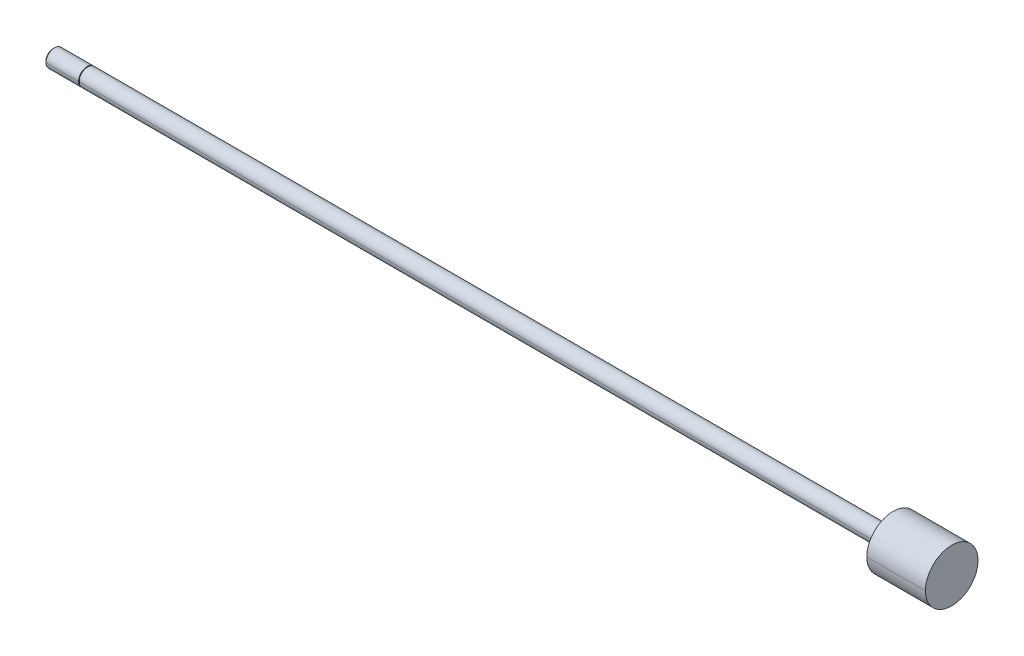
ISO-10303-21;
HEADER;
FILE_DESCRIPTION(('STEP AP214'),'2;1');
FILE_NAME('part.step','',(''),(''),'','','');
FILE_SCHEMA(('AUTOMOTIVE_DESIGN { 1 0 10303 214 1 1 1 1 }'));
ENDSEC;
DATA;
#1=APPLICATION_CONTEXT('core data for automotive mechanical design processes');
#2=APPLICATION_PROTOCOL_DEFINITION('international standard','automotive_design',2000,#1);
#3=PRODUCT_CONTEXT('',#1,'mechanical');
#4=PRODUCT('Part','Part','',(#3));
#5=PRODUCT_RELATED_PRODUCT_CATEGORY('part','',(#4));
#6=PRODUCT_DEFINITION_FORMATION('','',#4);
#7=PRODUCT_DEFINITION_CONTEXT('part definition',#1,'design');
#8=PRODUCT_DEFINITION('design','',#6,#7);
#9=PRODUCT_DEFINITION_SHAPE('','',#8);
#10=(LENGTH_UNIT() NAMED_UNIT(*) SI_UNIT(.MILLI.,.METRE.));
#11=(NAMED_UNIT(*) PLANE_ANGLE_UNIT() SI_UNIT($,.RADIAN.));
#12=(NAMED_UNIT(*) SI_UNIT($,.STERADIAN.) SOLID_ANGLE_UNIT());
#13=UNCERTAINTY_MEASURE_WITH_UNIT(LENGTH_MEASURE(1.E-05),#10,'distance_accuracy_value','');
#14=(GEOMETRIC_REPRESENTATION_CONTEXT(3) GLOBAL_UNCERTAINTY_ASSIGNED_CONTEXT((#13)) GLOBAL_UNIT_ASSIGNED_CONTEXT((#10,
#11,#12)) REPRESENTATION_CONTEXT('',''));
#15=CARTESIAN_POINT('',(0.,0.,0.));
#16=DIRECTION('',(0.,0.,1.));
#17=DIRECTION('',(1.,0.,0.));
#18=AXIS2_PLACEMENT_3D('',#15,#16,#17);
#19=CARTESIAN_POINT('',(0.,0.,0.));
#20=DIRECTION('',(-1.,0.,0.));
#21=DIRECTION('',(0.,-1.,0.));
#22=AXIS2_PLACEMENT_3D('',#19,#20,#21);
#23=CYLINDRICAL_SURFACE('',#22,2.921);
#24=CARTESIAN_POINT('',(0.,0.,0.));
#25=DIRECTION('',(1.,0.,0.));
#26=DIRECTION('',(0.,0.,-1.));
#27=AXIS2_PLACEMENT_3D('',#24,#25,#26);
#28=CIRCLE('',#27,2.921);
#29=CARTESIAN_POINT('',(0.,0.,-2.921));
#30=VERTEX_POINT('',#29);
#31=CARTESIAN_POINT('',(0.,0.,2.921));
#32=VERTEX_POINT('',#31);
#33=EDGE_CURVE('E10',#30,#32,#28,.T.);
#34=ORIENTED_EDGE('',*,*,#33,.F.);
#35=DIRECTION('',(-1.,0.,0.));
#36=VECTOR('',#35,1.);
#37=CARTESIAN_POINT('',(0.,0.,-2.921));
#38=LINE('',#37,#36);
#39=CARTESIAN_POINT('',(-0.254,0.,-2.921));
#40=VERTEX_POINT('',#39);
#41=EDGE_CURVE('E23',#30,#40,#38,.T.);
#42=ORIENTED_EDGE('',*,*,#41,.T.);
#43=CARTESIAN_POINT('',(-0.254,0.,0.));
#44=DIRECTION('',(1.,0.,0.));
#45=DIRECTION('',(0.,0.,-1.));
#46=AXIS2_PLACEMENT_3D('',#43,#44,#45);
#47=CIRCLE('',#46,2.921);
#48=CARTESIAN_POINT('',(-0.254,0.,2.921));
#49=VERTEX_POINT('',#48);
#50=EDGE_CURVE('E209',#40,#49,#47,.T.);
#51=ORIENTED_EDGE('',*,*,#50,.T.);
#52=DIRECTION('',(-1.,0.,0.));
#53=VECTOR('',#52,1.);
#54=CARTESIAN_POINT('',(0.,0.,2.921));
#55=LINE('',#54,#53);
#56=EDGE_CURVE('E204',#32,#49,#55,.T.);
#57=ORIENTED_EDGE('',*,*,#56,.F.);
#58=EDGE_LOOP('',(#34,#42,#51,#57));
#59=FACE_BOUND('',#58,.T.);
#60=ADVANCED_FACE('F15',(#59),#23,.T.);
#61=CARTESIAN_POINT('',(0.,0.,0.));
#62=DIRECTION('',(-1.,0.,0.));
#63=DIRECTION('',(0.,1.,0.));
#64=AXIS2_PLACEMENT_3D('',#61,#62,#63);
#65=CYLINDRICAL_SURFACE('',#64,2.921);
#66=CARTESIAN_POINT('',(-0.254,0.,0.));
#67=DIRECTION('',(1.,0.,0.));
#68=DIRECTION('',(0.,0.,-1.));
#69=AXIS2_PLACEMENT_3D('',#66,#67,#68);
#70=CIRCLE('',#69,2.921);
#71=EDGE_CURVE('E200',#49,#40,#70,.T.);
#72=ORIENTED_EDGE('',*,*,#71,.T.);
#73=ORIENTED_EDGE('',*,*,#41,.F.);
#74=CARTESIAN_POINT('',(0.,0.,0.));
#75=DIRECTION('',(1.,0.,0.));
#76=DIRECTION('',(0.,0.,-1.));
#77=AXIS2_PLACEMENT_3D('',#74,#75,#76);
#78=CIRCLE('',#77,2.921);
#79=EDGE_CURVE('E195',#32,#30,#78,.T.);
#80=ORIENTED_EDGE('',*,*,#79,.F.);
#81=ORIENTED_EDGE('',*,*,#56,.T.);
#82=EDGE_LOOP('',(#72,#73,#80,#81));
#83=FACE_BOUND('',#82,.T.);
#84=ADVANCED_FACE('F222',(#83),#65,.T.);
#85=CARTESIAN_POINT('',(0.,2.921,0.));
#86=DIRECTION('',(1.,0.,0.));
#87=DIRECTION('',(0.,0.,-1.));
#88=AXIS2_PLACEMENT_3D('',#85,#86,#87);
#89=PLANE('',#88);
#90=CARTESIAN_POINT('',(0.,0.,0.));
#91=DIRECTION('',(1.,0.,0.));
#92=DIRECTION('',(0.,0.,-1.));
#93=AXIS2_PLACEMENT_3D('',#90,#91,#92);
#94=CIRCLE('',#93,3.175);
#95=CARTESIAN_POINT('',(0.,0.,-3.175));
#96=VERTEX_POINT('',#95);
#97=CARTESIAN_POINT('',(0.,0.,3.175));
#98=VERTEX_POINT('',#97);
#99=EDGE_CURVE('E190',#96,#98,#94,.T.);
#100=ORIENTED_EDGE('',*,*,#99,.F.);
#101=CARTESIAN_POINT('',(0.,0.,0.));
#102=DIRECTION('',(1.,0.,0.));
#103=DIRECTION('',(0.,0.,-1.));
#104=AXIS2_PLACEMENT_3D('',#101,#102,#103);
#105=CIRCLE('',#104,3.175);
#106=EDGE_CURVE('E185',#98,#96,#105,.T.);
#107=ORIENTED_EDGE('',*,*,#106,.F.);
#108=EDGE_LOOP('',(#100,#107));
#109=FACE_BOUND('',#108,.T.);
#110=ORIENTED_EDGE('',*,*,#33,.T.);
#111=ORIENTED_EDGE('',*,*,#79,.T.);
#112=EDGE_LOOP('',(#110,#111));
#113=FACE_BOUND('',#112,.T.);
#114=ADVANCED_FACE('F247',(#109,#113),#89,.F.);
#115=CARTESIAN_POINT('',(315.9252,0.,0.));
#116=DIRECTION('',(-1.,0.,0.));
#117=DIRECTION('',(0.,1.,0.));
#118=AXIS2_PLACEMENT_3D('',#115,#116,#117);
#119=CYLINDRICAL_SURFACE('',#118,3.175);
#120=ORIENTED_EDGE('',*,*,#106,.T.);
#121=DIRECTION('',(-1.,0.,0.));
#122=VECTOR('',#121,1.);
#123=CARTESIAN_POINT('',(294.4876,0.,-3.175));
#124=LINE('',#123,#122);
#125=CARTESIAN_POINT('',(294.4876,0.,-3.175));
#126=VERTEX_POINT('',#125);
#127=EDGE_CURVE('E180',#126,#96,#124,.T.);
#128=ORIENTED_EDGE('',*,*,#127,.F.);
#129=CARTESIAN_POINT('',(294.4876,0.,0.));
#130=DIRECTION('',(1.,0.,0.));
#131=DIRECTION('',(0.,0.,-1.));
#132=AXIS2_PLACEMENT_3D('',#129,#130,#131);
#133=CIRCLE('',#132,3.175);
#134=CARTESIAN_POINT('',(294.4876,0.,3.175));
#135=VERTEX_POINT('',#134);
#136=EDGE_CURVE('E175',#135,#126,#133,.T.);
#137=ORIENTED_EDGE('',*,*,#136,.F.);
#138=DIRECTION('',(-1.,0.,0.));
#139=VECTOR('',#138,1.);
#140=CARTESIAN_POINT('',(294.4876,0.,3.175));
#141=LINE('',#140,#139);
#142=EDGE_CURVE('E170',#135,#98,#141,.T.);
#143=ORIENTED_EDGE('',*,*,#142,.T.);
#144=EDGE_LOOP('',(#120,#128,#137,#143));
#145=FACE_BOUND('',#144,.T.);
#146=ADVANCED_FACE('F251',(#145),#119,.T.);
#147=CARTESIAN_POINT('',(315.9252,0.,0.));
#148=DIRECTION('',(-1.,0.,0.));
#149=DIRECTION('',(0.,-1.,0.));
#150=AXIS2_PLACEMENT_3D('',#147,#148,#149);
#151=CYLINDRICAL_SURFACE('',#150,3.175);
#152=CARTESIAN_POINT('',(294.4876,0.,0.));
#153=DIRECTION('',(1.,0.,0.));
#154=DIRECTION('',(0.,0.,-1.));
#155=AXIS2_PLACEMENT_3D('',#152,#153,#154);
#156=CIRCLE('',#155,3.175);
#157=EDGE_CURVE('E165',#126,#135,#156,.T.);
#158=ORIENTED_EDGE('',*,*,#157,.F.);
#159=ORIENTED_EDGE('',*,*,#127,.T.);
#160=ORIENTED_EDGE('',*,*,#99,.T.);
#161=ORIENTED_EDGE('',*,*,#142,.F.);
#162=EDGE_LOOP('',(#158,#159,#160,#161));
#163=FACE_BOUND('',#162,.T.);
#164=ADVANCED_FACE('F257',(#163),#151,.T.);
#165=CARTESIAN_POINT('',(294.4876,3.175,0.));
#166=DIRECTION('',(1.,0.,0.));
#167=DIRECTION('',(0.,0.,-1.));
#168=AXIS2_PLACEMENT_3D('',#165,#166,#167);
#169=PLANE('',#168);
#170=CARTESIAN_POINT('',(294.4876,0.,0.));
#171=DIRECTION('',(1.,0.,0.));
#172=DIRECTION('',(0.,0.,-1.));
#173=AXIS2_PLACEMENT_3D('',#170,#171,#172);
#174=CIRCLE('',#173,9.62025);
#175=CARTESIAN_POINT('',(294.4876,0.,-9.62025));
#176=VERTEX_POINT('',#175);
#177=CARTESIAN_POINT('',(294.4876,0.,9.62025));
#178=VERTEX_POINT('',#177);
#179=EDGE_CURVE('E160',#176,#178,#174,.T.);
#180=ORIENTED_EDGE('',*,*,#179,.F.);
#181=CARTESIAN_POINT('',(294.4876,0.,0.));
#182=DIRECTION('',(1.,0.,0.));
#183=DIRECTION('',(0.,0.,-1.));
#184=AXIS2_PLACEMENT_3D('',#181,#182,#183);
#185=CIRCLE('',#184,9.62025);
#186=EDGE_CURVE('E155',#178,#176,#185,.T.);
#187=ORIENTED_EDGE('',*,*,#186,.F.);
#188=EDGE_LOOP('',(#180,#187));
#189=FACE_BOUND('',#188,.T.);
#190=ORIENTED_EDGE('',*,*,#157,.T.);
#191=ORIENTED_EDGE('',*,*,#136,.T.);
#192=EDGE_LOOP('',(#190,#191));
#193=FACE_BOUND('',#192,.T.);
#194=ADVANCED_FACE('F261',(#189,#193),#169,.F.);
#195=CARTESIAN_POINT('',(315.9252,0.,0.));
#196=DIRECTION('',(-1.,0.,0.));
#197=DIRECTION('',(0.,1.,0.));
#198=AXIS2_PLACEMENT_3D('',#195,#196,#197);
#199=CYLINDRICAL_SURFACE('',#198,9.62025);
#200=ORIENTED_EDGE('',*,*,#186,.T.);
#201=DIRECTION('',(-1.,0.,0.));
#202=VECTOR('',#201,1.);
#203=CARTESIAN_POINT('',(315.9252,0.,-9.62025));
#204=LINE('',#203,#202);
#205=CARTESIAN_POINT('',(315.9252,0.,-9.62025));
#206=VERTEX_POINT('',#205);
#207=EDGE_CURVE('E150',#206,#176,#204,.T.);
#208=ORIENTED_EDGE('',*,*,#207,.F.);
#209=CARTESIAN_POINT('',(315.9252,0.,0.));
#210=DIRECTION('',(1.,0.,0.));
#211=DIRECTION('',(0.,0.,-1.));
#212=AXIS2_PLACEMENT_3D('',#209,#210,#211);
#213=CIRCLE('',#212,9.62025);
#214=CARTESIAN_POINT('',(315.9252,0.,9.62025));
#215=VERTEX_POINT('',#214);
#216=EDGE_CURVE('E145',#215,#206,#213,.T.);
#217=ORIENTED_EDGE('',*,*,#216,.F.);
#218=DIRECTION('',(-1.,0.,0.));
#219=VECTOR('',#218,1.);
#220=CARTESIAN_POINT('',(315.9252,0.,9.62025));
#221=LINE('',#220,#219);
#222=EDGE_CURVE('E140',#215,#178,#221,.T.);
#223=ORIENTED_EDGE('',*,*,#222,.T.);
#224=EDGE_LOOP('',(#200,#208,#217,#223));
#225=FACE_BOUND('',#224,.T.);
#226=ADVANCED_FACE('F265',(#225),#199,.T.);
#227=CARTESIAN_POINT('',(315.9252,0.,0.));
#228=DIRECTION('',(-1.,0.,0.));
#229=DIRECTION('',(0.,-1.,0.));
#230=AXIS2_PLACEMENT_3D('',#227,#228,#229);
#231=CYLINDRICAL_SURFACE('',#230,9.62025);
#232=CARTESIAN_POINT('',(315.9252,0.,0.));
#233=DIRECTION('',(1.,0.,0.));
#234=DIRECTION('',(0.,0.,-1.));
#235=AXIS2_PLACEMENT_3D('',#232,#233,#234);
#236=CIRCLE('',#235,9.62025);
#237=EDGE_CURVE('E135',#206,#215,#236,.T.);
#238=ORIENTED_EDGE('',*,*,#237,.F.);
#239=ORIENTED_EDGE('',*,*,#207,.T.);
#240=ORIENTED_EDGE('',*,*,#179,.T.);
#241=ORIENTED_EDGE('',*,*,#222,.F.);
#242=EDGE_LOOP('',(#238,#239,#240,#241));
#243=FACE_BOUND('',#242,.T.);
#244=ADVANCED_FACE('F269',(#243),#231,.T.);
#245=CARTESIAN_POINT('',(315.9252,9.62025,0.));
#246=DIRECTION('',(-1.,0.,0.));
#247=DIRECTION('',(0.,0.,1.));
#248=AXIS2_PLACEMENT_3D('',#245,#246,#247);
#249=PLANE('',#248);
#250=ORIENTED_EDGE('',*,*,#237,.T.);
#251=ORIENTED_EDGE('',*,*,#216,.T.);
#252=EDGE_LOOP('',(#250,#251));
#253=FACE_BOUND('',#252,.T.);
#254=ADVANCED_FACE('F227',(#253),#249,.F.);
#255=CARTESIAN_POINT('',(-0.254,3.429,0.));
#256=DIRECTION('',(-1.,0.,0.));
#257=DIRECTION('',(0.,0.,1.));
#258=AXIS2_PLACEMENT_3D('',#255,#256,#257);
#259=PLANE('',#258);
#260=ORIENTED_EDGE('',*,*,#50,.F.);
#261=ORIENTED_EDGE('',*,*,#71,.F.);
#262=EDGE_LOOP('',(#260,#261));
#263=FACE_BOUND('',#262,.T.);
#264=CARTESIAN_POINT('',(-0.253999999999976,0.,0.));
#265=DIRECTION('',(-1.,0.,0.));
#266=DIRECTION('',(0.,0.,1.));
#267=AXIS2_PLACEMENT_3D('',#264,#265,#266);
#268=CIRCLE('',#267,3.175);
#269=CARTESIAN_POINT('',(-0.253999999999976,0.,3.175));
#270=VERTEX_POINT('',#269);
#271=CARTESIAN_POINT('',(-0.253999999999962,0.,-3.175));
#272=VERTEX_POINT('',#271);
#273=EDGE_CURVE('E130',#270,#272,#268,.T.);
#274=ORIENTED_EDGE('',*,*,#273,.F.);
#275=CARTESIAN_POINT('',(-0.253999999999976,0.,0.));
#276=DIRECTION('',(-1.,0.,0.));
#277=DIRECTION('',(0.,0.,1.));
#278=AXIS2_PLACEMENT_3D('',#275,#276,#277);
#279=CIRCLE('',#278,3.175);
#280=EDGE_CURVE('E125',#272,#270,#279,.T.);
#281=ORIENTED_EDGE('',*,*,#280,.F.);
#282=EDGE_LOOP('',(#274,#281));
#283=FACE_BOUND('',#282,.T.);
#284=ADVANCED_FACE('F223',(#263,#283),#259,.F.);
#285=CARTESIAN_POINT('',(315.9252,0.,0.));
#286=DIRECTION('',(-1.,0.,0.));
#287=DIRECTION('',(0.,1.,0.));
#288=AXIS2_PLACEMENT_3D('',#285,#286,#287);
#289=CYLINDRICAL_SURFACE('',#288,3.175);
#290=CARTESIAN_POINT('',(-12.15898,0.,0.));
#291=DIRECTION('',(1.,0.,0.));
#292=DIRECTION('',(0.,0.,-1.));
#293=AXIS2_PLACEMENT_3D('',#290,#291,#292);
#294=CIRCLE('',#293,3.175);
#295=CARTESIAN_POINT('',(-12.15898,0.,3.175));
#296=VERTEX_POINT('',#295);
#297=CARTESIAN_POINT('',(-12.15898,0.,-3.175));
#298=VERTEX_POINT('',#297);
#299=EDGE_CURVE('E96',#296,#298,#294,.T.);
#300=ORIENTED_EDGE('',*,*,#299,.T.);
#301=DIRECTION('',(-1.,0.,0.));
#302=VECTOR('',#301,1.);
#303=CARTESIAN_POINT('',(-0.253999999999962,0.,-3.175));
#304=LINE('',#303,#302);
#305=EDGE_CURVE('E117',#272,#298,#304,.T.);
#306=ORIENTED_EDGE('',*,*,#305,.F.);
#307=ORIENTED_EDGE('',*,*,#280,.T.);
#308=DIRECTION('',(-1.,0.,0.));
#309=VECTOR('',#308,1.);
#310=CARTESIAN_POINT('',(-0.253999999999962,0.,3.175));
#311=LINE('',#310,#309);
#312=EDGE_CURVE('E113',#270,#296,#311,.T.);
#313=ORIENTED_EDGE('',*,*,#312,.T.);
#314=EDGE_LOOP('',(#300,#306,#307,#313));
#315=FACE_BOUND('',#314,.T.);
#316=ADVANCED_FACE('F226',(#315),#289,.T.);
#317=CARTESIAN_POINT('',(315.9252,0.,0.));
#318=DIRECTION('',(-1.,0.,0.));
#319=DIRECTION('',(0.,-1.,0.));
#320=AXIS2_PLACEMENT_3D('',#317,#318,#319);
#321=CYLINDRICAL_SURFACE('',#320,3.175);
#322=ORIENTED_EDGE('',*,*,#273,.T.);
#323=ORIENTED_EDGE('',*,*,#305,.T.);
#324=CARTESIAN_POINT('',(-12.15898,0.,0.));
#325=DIRECTION('',(1.,0.,0.));
#326=DIRECTION('',(0.,0.,-1.));
#327=AXIS2_PLACEMENT_3D('',#324,#325,#326);
#328=CIRCLE('',#327,3.175);
#329=EDGE_CURVE('E108',#298,#296,#328,.T.);
#330=ORIENTED_EDGE('',*,*,#329,.T.);
#331=ORIENTED_EDGE('',*,*,#312,.F.);
#332=EDGE_LOOP('',(#322,#323,#330,#331));
#333=FACE_BOUND('',#332,.T.);
#334=ADVANCED_FACE('F233',(#333),#321,.T.);
#335=CARTESIAN_POINT('',(-12.7,0.,0.));
#336=DIRECTION('',(1.,0.,0.));
#337=DIRECTION('',(0.,-1.,0.));
#338=AXIS2_PLACEMENT_3D('',#335,#336,#337);
#339=CONICAL_SURFACE('',#338,2.63398,0.7853981634);
#340=ORIENTED_EDGE('',*,*,#329,.F.);
#341=DIRECTION('',(0.707106781184742,0.,-0.707106781188353));
#342=VECTOR('',#341,1.);
#343=CARTESIAN_POINT('',(-12.7,0.,-2.63398));
#344=LINE('',#343,#342);
#345=CARTESIAN_POINT('',(-12.7,0.,-2.63398));
#346=VERTEX_POINT('',#345);
#347=EDGE_CURVE('E88',#346,#298,#344,.T.);
#348=ORIENTED_EDGE('',*,*,#347,.F.);
#349=CARTESIAN_POINT('',(-12.7,0.,0.));
#350=DIRECTION('',(1.,0.,0.));
#351=DIRECTION('',(0.,0.,-1.));
#352=AXIS2_PLACEMENT_3D('',#349,#350,#351);
#353=CIRCLE('',#352,2.63398);
#354=CARTESIAN_POINT('',(-12.7,0.,2.63398));
#355=VERTEX_POINT('',#354);
#356=EDGE_CURVE('E81',#346,#355,#353,.T.);
#357=ORIENTED_EDGE('',*,*,#356,.T.);
#358=DIRECTION('',(0.707106781184742,0.,0.707106781188353));
#359=VECTOR('',#358,1.);
#360=CARTESIAN_POINT('',(-12.7,0.,2.63398));
#361=LINE('',#360,#359);
#362=EDGE_CURVE('E85',#355,#296,#361,.T.);
#363=ORIENTED_EDGE('',*,*,#362,.T.);
#364=EDGE_LOOP('',(#340,#348,#357,#363));
#365=FACE_BOUND('',#364,.T.);
#366=ADVANCED_FACE('F84',(#365),#339,.T.);
#367=CARTESIAN_POINT('',(-12.7,0.,0.));
#368=DIRECTION('',(1.,0.,0.));
#369=DIRECTION('',(0.,1.,0.));
#370=AXIS2_PLACEMENT_3D('',#367,#368,#369);
#371=CONICAL_SURFACE('',#370,2.63398,0.7853981634);
#372=CARTESIAN_POINT('',(-12.7,0.,0.));
#373=DIRECTION('',(1.,0.,0.));
#374=DIRECTION('',(0.,0.,-1.));
#375=AXIS2_PLACEMENT_3D('',#372,#373,#374);
#376=CIRCLE('',#375,2.63398);
#377=EDGE_CURVE('E95',#355,#346,#376,.T.);
#378=ORIENTED_EDGE('',*,*,#377,.T.);
#379=ORIENTED_EDGE('',*,*,#347,.T.);
#380=ORIENTED_EDGE('',*,*,#299,.F.);
#381=ORIENTED_EDGE('',*,*,#362,.F.);
#382=EDGE_LOOP('',(#378,#379,#380,#381));
#383=FACE_BOUND('',#382,.T.);
#384=ADVANCED_FACE('F94',(#383),#371,.T.);
#385=CARTESIAN_POINT('',(-12.7,0.,0.));
#386=DIRECTION('',(1.,0.,0.));
#387=DIRECTION('',(0.,0.,-1.));
#388=AXIS2_PLACEMENT_3D('',#385,#386,#387);
#389=PLANE('',#388);
#390=ORIENTED_EDGE('',*,*,#356,.F.);
#391=ORIENTED_EDGE('',*,*,#377,.F.);
#392=EDGE_LOOP('',(#390,#391));
#393=FACE_BOUND('',#392,.T.);
#394=ADVANCED_FACE('F98',(#393),#389,.F.);
#395=CLOSED_SHELL('',(#60,#84,#114,#146,#164,#194,#226,#244,#254,#284,#316,#334,#366,#384,#394));
#396=MANIFOLD_SOLID_BREP('B1',#395);
#397=ADVANCED_BREP_SHAPE_REPRESENTATION('',(#18,#396),#14);
#398=SHAPE_DEFINITION_REPRESENTATION(#9,#397);
ENDSEC;
END-ISO-10303-21;
